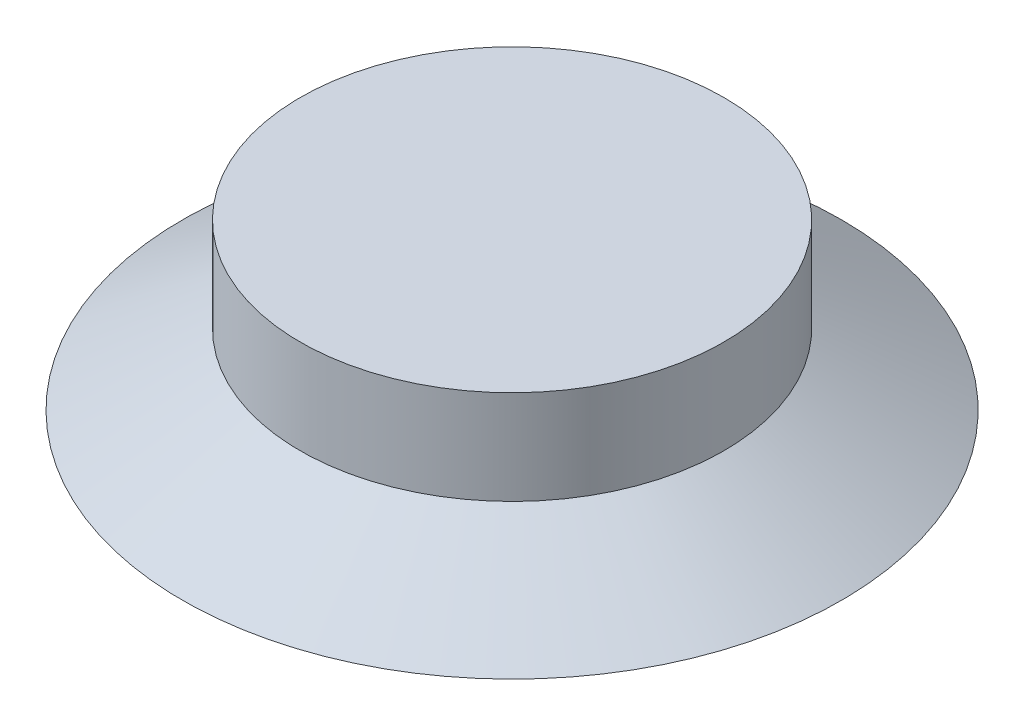
ISO-10303-21;
HEADER;
FILE_DESCRIPTION(('STEP AP214'),'2;1');
FILE_NAME('part.step','',(''),(''),'','','');
FILE_SCHEMA(('AUTOMOTIVE_DESIGN { 1 0 10303 214 1 1 1 1 }'));
ENDSEC;
DATA;
#1=APPLICATION_CONTEXT('core data for automotive mechanical design processes');
#2=APPLICATION_PROTOCOL_DEFINITION('international standard','automotive_design',2000,#1);
#3=PRODUCT_CONTEXT('',#1,'mechanical');
#4=PRODUCT('Part','Part','',(#3));
#5=PRODUCT_RELATED_PRODUCT_CATEGORY('part','',(#4));
#6=PRODUCT_DEFINITION_FORMATION('','',#4);
#7=PRODUCT_DEFINITION_CONTEXT('part definition',#1,'design');
#8=PRODUCT_DEFINITION('design','',#6,#7);
#9=PRODUCT_DEFINITION_SHAPE('','',#8);
#10=(LENGTH_UNIT() NAMED_UNIT(*) SI_UNIT(.MILLI.,.METRE.));
#11=(NAMED_UNIT(*) PLANE_ANGLE_UNIT() SI_UNIT($,.RADIAN.));
#12=(NAMED_UNIT(*) SI_UNIT($,.STERADIAN.) SOLID_ANGLE_UNIT());
#13=UNCERTAINTY_MEASURE_WITH_UNIT(LENGTH_MEASURE(1.E-05),#10,'distance_accuracy_value','');
#14=(GEOMETRIC_REPRESENTATION_CONTEXT(3) GLOBAL_UNCERTAINTY_ASSIGNED_CONTEXT((#13)) GLOBAL_UNIT_ASSIGNED_CONTEXT((#10,
#11,#12)) REPRESENTATION_CONTEXT('',''));
#15=CARTESIAN_POINT('',(0.,0.,0.));
#16=DIRECTION('',(0.,0.,1.));
#17=DIRECTION('',(1.,0.,0.));
#18=AXIS2_PLACEMENT_3D('',#15,#16,#17);
#19=CARTESIAN_POINT('',(0.,-2.5,0.));
#20=DIRECTION('',(0.,1.,0.));
#21=DIRECTION('',(0.,0.,1.));
#22=AXIS2_PLACEMENT_3D('',#19,#20,#21);
#23=PLANE('',#22);
#24=CARTESIAN_POINT('',(-2.25,-2.5,0.));
#25=DIRECTION('',(0.,-1.,0.));
#26=DIRECTION('',(0.,0.,-1.));
#27=AXIS2_PLACEMENT_3D('',#24,#25,#26);
#28=CIRCLE('',#27,7.);
#29=CARTESIAN_POINT('',(-2.25,-2.5,-7.));
#30=VERTEX_POINT('',#29);
#31=EDGE_CURVE('E12',#30,#30,#28,.T.);
#32=ORIENTED_EDGE('',*,*,#31,.T.);
#33=EDGE_LOOP('',(#32));
#34=FACE_BOUND('',#33,.T.);
#35=ADVANCED_FACE('F40',(#34),#23,.F.);
#36=CARTESIAN_POINT('',(-2.25,-1.,0.));
#37=DIRECTION('',(0.,-1.,0.));
#38=DIRECTION('',(0.,0.,-1.));
#39=AXIS2_PLACEMENT_3D('',#36,#37,#38);
#40=CONICAL_SURFACE('',#39,4.5,1.03037682652431);
#41=ORIENTED_EDGE('',*,*,#31,.F.);
#42=EDGE_LOOP('',(#41));
#43=FACE_BOUND('',#42,.T.);
#44=CARTESIAN_POINT('',(-2.25,-1.,0.));
#45=DIRECTION('',(0.,-1.,0.));
#46=DIRECTION('',(0.,0.,-1.));
#47=AXIS2_PLACEMENT_3D('',#44,#45,#46);
#48=CIRCLE('',#47,4.5);
#49=CARTESIAN_POINT('',(-2.25,-1.,-4.5));
#50=VERTEX_POINT('',#49);
#51=EDGE_CURVE('E46',#50,#50,#48,.T.);
#52=ORIENTED_EDGE('',*,*,#51,.T.);
#53=EDGE_LOOP('',(#52));
#54=FACE_BOUND('',#53,.T.);
#55=ADVANCED_FACE('F66',(#43,#54),#40,.T.);
#56=CARTESIAN_POINT('',(-2.25,-1.,0.));
#57=DIRECTION('',(0.,-1.,0.));
#58=DIRECTION('',(0.,0.,-1.));
#59=AXIS2_PLACEMENT_3D('',#56,#57,#58);
#60=CYLINDRICAL_SURFACE('',#59,4.5);
#61=CARTESIAN_POINT('',(-2.25,1.,0.));
#62=DIRECTION('',(0.,-1.,0.));
#63=DIRECTION('',(0.,0.,-1.));
#64=AXIS2_PLACEMENT_3D('',#61,#62,#63);
#65=CIRCLE('',#64,4.5);
#66=CARTESIAN_POINT('',(-2.25,1.,-4.5));
#67=VERTEX_POINT('',#66);
#68=EDGE_CURVE('E50',#67,#67,#65,.T.);
#69=ORIENTED_EDGE('',*,*,#68,.T.);
#70=EDGE_LOOP('',(#69));
#71=FACE_BOUND('',#70,.T.);
#72=ORIENTED_EDGE('',*,*,#51,.F.);
#73=EDGE_LOOP('',(#72));
#74=FACE_BOUND('',#73,.T.);
#75=ADVANCED_FACE('F57',(#71,#74),#60,.T.);
#76=CARTESIAN_POINT('',(0.,1.,0.));
#77=DIRECTION('',(0.,1.,0.));
#78=DIRECTION('',(0.,0.,1.));
#79=AXIS2_PLACEMENT_3D('',#76,#77,#78);
#80=PLANE('',#79);
#81=ORIENTED_EDGE('',*,*,#68,.F.);
#82=EDGE_LOOP('',(#81));
#83=FACE_BOUND('',#82,.T.);
#84=ADVANCED_FACE('F60',(#83),#80,.T.);
#85=CLOSED_SHELL('',(#35,#55,#75,#84));
#86=MANIFOLD_SOLID_BREP('B2',#85);
#87=ADVANCED_BREP_SHAPE_REPRESENTATION('',(#18,#86),#14);
#88=SHAPE_DEFINITION_REPRESENTATION(#9,#87);
ENDSEC;
END-ISO-10303-21;
